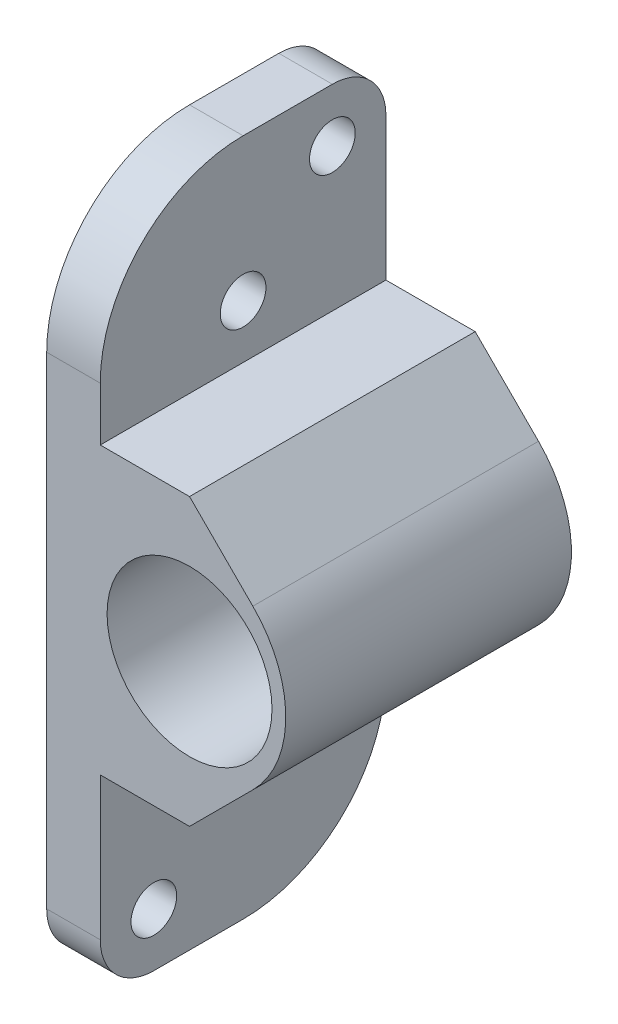
ISO-10303-21;
HEADER;
FILE_DESCRIPTION(('STEP AP214'),'2;1');
FILE_NAME('part.step','',(''),(''),'','','');
FILE_SCHEMA(('AUTOMOTIVE_DESIGN { 1 0 10303 214 1 1 1 1 }'));
ENDSEC;
DATA;
#1=APPLICATION_CONTEXT('core data for automotive mechanical design processes');
#2=APPLICATION_PROTOCOL_DEFINITION('international standard','automotive_design',2000,#1);
#3=PRODUCT_CONTEXT('',#1,'mechanical');
#4=PRODUCT('Part','Part','',(#3));
#5=PRODUCT_RELATED_PRODUCT_CATEGORY('part','',(#4));
#6=PRODUCT_DEFINITION_FORMATION('','',#4);
#7=PRODUCT_DEFINITION_CONTEXT('part definition',#1,'design');
#8=PRODUCT_DEFINITION('design','',#6,#7);
#9=PRODUCT_DEFINITION_SHAPE('','',#8);
#10=(LENGTH_UNIT() NAMED_UNIT(*) SI_UNIT(.MILLI.,.METRE.));
#11=(NAMED_UNIT(*) PLANE_ANGLE_UNIT() SI_UNIT($,.RADIAN.));
#12=(NAMED_UNIT(*) SI_UNIT($,.STERADIAN.) SOLID_ANGLE_UNIT());
#13=UNCERTAINTY_MEASURE_WITH_UNIT(LENGTH_MEASURE(1.E-05),#10,'distance_accuracy_value','');
#14=(GEOMETRIC_REPRESENTATION_CONTEXT(3) GLOBAL_UNCERTAINTY_ASSIGNED_CONTEXT((#13)) GLOBAL_UNIT_ASSIGNED_CONTEXT((#10,
#11,#12)) REPRESENTATION_CONTEXT('',''));
#15=CARTESIAN_POINT('',(0.,0.,0.));
#16=DIRECTION('',(0.,0.,1.));
#17=DIRECTION('',(1.,0.,0.));
#18=AXIS2_PLACEMENT_3D('',#15,#16,#17);
#19=CARTESIAN_POINT('',(-12.7,12.7,25.4));
#20=DIRECTION('',(0.,-1.,0.));
#21=DIRECTION('',(1.,0.,0.));
#22=AXIS2_PLACEMENT_3D('',#19,#20,#21);
#23=PLANE('',#22);
#24=DIRECTION('',(0.,0.,-1.));
#25=VECTOR('',#24,1.);
#26=CARTESIAN_POINT('',(-7.93749999999999,12.7,0.));
#27=LINE('',#26,#25);
#28=CARTESIAN_POINT('',(-7.93749999999999,12.7,25.4));
#29=VERTEX_POINT('',#28);
#30=CARTESIAN_POINT('',(-7.93749999999999,12.7,0.));
#31=VERTEX_POINT('',#30);
#32=EDGE_CURVE('E59',#29,#31,#27,.T.);
#33=ORIENTED_EDGE('',*,*,#32,.F.);
#34=DIRECTION('',(-1.,0.,0.));
#35=VECTOR('',#34,1.);
#36=CARTESIAN_POINT('',(-12.7,12.7,25.4));
#37=LINE('',#36,#35);
#38=CARTESIAN_POINT('',(0.,12.7,25.4));
#39=VERTEX_POINT('',#38);
#40=EDGE_CURVE('E168',#39,#29,#37,.T.);
#41=ORIENTED_EDGE('',*,*,#40,.F.);
#42=DIRECTION('',(0.,0.,-1.));
#43=VECTOR('',#42,1.);
#44=CARTESIAN_POINT('',(0.,12.7,25.4));
#45=LINE('',#44,#43);
#46=CARTESIAN_POINT('',(0.,12.7,0.));
#47=VERTEX_POINT('',#46);
#48=EDGE_CURVE('E280',#39,#47,#45,.T.);
#49=ORIENTED_EDGE('',*,*,#48,.T.);
#50=DIRECTION('',(-1.,0.,0.));
#51=VECTOR('',#50,1.);
#52=CARTESIAN_POINT('',(-12.7,12.7,0.));
#53=LINE('',#52,#51);
#54=EDGE_CURVE('E252',#47,#31,#53,.T.);
#55=ORIENTED_EDGE('',*,*,#54,.T.);
#56=EDGE_LOOP('',(#33,#41,#49,#55));
#57=FACE_BOUND('',#56,.T.);
#58=ADVANCED_FACE('F43',(#57),#23,.F.);
#59=CARTESIAN_POINT('',(-12.7,-12.7,25.4));
#60=DIRECTION('',(0.,1.,0.));
#61=DIRECTION('',(0.,0.,1.));
#62=AXIS2_PLACEMENT_3D('',#59,#60,#61);
#63=PLANE('',#62);
#64=DIRECTION('',(0.,0.,1.));
#65=VECTOR('',#64,1.);
#66=CARTESIAN_POINT('',(-7.9375,-12.7,0.));
#67=LINE('',#66,#65);
#68=CARTESIAN_POINT('',(-7.9375,-12.7,0.));
#69=VERTEX_POINT('',#68);
#70=CARTESIAN_POINT('',(-7.9375,-12.7,25.4));
#71=VERTEX_POINT('',#70);
#72=EDGE_CURVE('E69',#69,#71,#67,.T.);
#73=ORIENTED_EDGE('',*,*,#72,.F.);
#74=DIRECTION('',(1.,0.,0.));
#75=VECTOR('',#74,1.);
#76=CARTESIAN_POINT('',(-12.7,-12.7,0.));
#77=LINE('',#76,#75);
#78=CARTESIAN_POINT('',(0.,-12.7,0.));
#79=VERTEX_POINT('',#78);
#80=EDGE_CURVE('E257',#69,#79,#77,.T.);
#81=ORIENTED_EDGE('',*,*,#80,.T.);
#82=DIRECTION('',(0.,0.,1.));
#83=VECTOR('',#82,1.);
#84=CARTESIAN_POINT('',(0.,-12.7,25.4));
#85=LINE('',#84,#83);
#86=CARTESIAN_POINT('',(0.,-12.7,25.4));
#87=VERTEX_POINT('',#86);
#88=EDGE_CURVE('E268',#79,#87,#85,.T.);
#89=ORIENTED_EDGE('',*,*,#88,.T.);
#90=DIRECTION('',(1.,0.,0.));
#91=VECTOR('',#90,1.);
#92=CARTESIAN_POINT('',(-12.7,-12.7,25.4));
#93=LINE('',#92,#91);
#94=EDGE_CURVE('E259',#71,#87,#93,.T.);
#95=ORIENTED_EDGE('',*,*,#94,.F.);
#96=EDGE_LOOP('',(#73,#81,#89,#95));
#97=FACE_BOUND('',#96,.T.);
#98=ADVANCED_FACE('F302',(#97),#63,.F.);
#99=CARTESIAN_POINT('',(0.,0.,25.4));
#100=DIRECTION('',(0.,0.,-1.));
#101=DIRECTION('',(-1.,0.,0.));
#102=AXIS2_PLACEMENT_3D('',#99,#100,#101);
#103=PLANE('',#102);
#104=DIRECTION('',(-0.707106781186549,-0.707106781186546,0.));
#105=VECTOR('',#104,1.);
#106=CARTESIAN_POINT('',(12.7,0.,25.4));
#107=LINE('',#106,#105);
#108=CARTESIAN_POINT('',(5.62893218813449,-7.07106781186549,25.4));
#109=VERTEX_POINT('',#108);
#110=EDGE_CURVE('E273',#87,#109,#107,.F.);
#111=ORIENTED_EDGE('',*,*,#110,.T.);
#112=CARTESIAN_POINT('',(-1.44213562373097,0.,25.4));
#113=DIRECTION('',(0.,0.,-1.));
#114=DIRECTION('',(-1.,0.,0.));
#115=AXIS2_PLACEMENT_3D('',#112,#113,#114);
#116=CIRCLE('',#115,10.);
#117=CARTESIAN_POINT('',(5.62893218813452,7.07106781186546,25.4));
#118=VERTEX_POINT('',#117);
#119=EDGE_CURVE('E281',#109,#118,#116,.F.);
#120=ORIENTED_EDGE('',*,*,#119,.T.);
#121=DIRECTION('',(0.707106781186546,-0.707106781186549,0.));
#122=VECTOR('',#121,1.);
#123=CARTESIAN_POINT('',(0.,12.7,25.4));
#124=LINE('',#123,#122);
#125=EDGE_CURVE('E271',#118,#39,#124,.F.);
#126=ORIENTED_EDGE('',*,*,#125,.T.);
#127=ORIENTED_EDGE('',*,*,#40,.T.);
#128=DIRECTION('',(0.,1.,0.));
#129=VECTOR('',#128,1.);
#130=CARTESIAN_POINT('',(-7.93749999999999,0.,25.4));
#131=LINE('',#130,#129);
#132=CARTESIAN_POINT('',(-7.93749999999999,17.4625,25.4));
#133=VERTEX_POINT('',#132);
#134=EDGE_CURVE('E160',#29,#133,#131,.T.);
#135=ORIENTED_EDGE('',*,*,#134,.T.);
#136=DIRECTION('',(-1.,0.,0.));
#137=VECTOR('',#136,1.);
#138=CARTESIAN_POINT('',(-7.93749999999999,17.4625,25.4));
#139=LINE('',#138,#137);
#140=CARTESIAN_POINT('',(-12.7,17.4625,25.4));
#141=VERTEX_POINT('',#140);
#142=EDGE_CURVE('E143',#133,#141,#139,.T.);
#143=ORIENTED_EDGE('',*,*,#142,.T.);
#144=DIRECTION('',(0.,-1.,0.));
#145=VECTOR('',#144,1.);
#146=CARTESIAN_POINT('',(-12.7,-12.7,25.4));
#147=LINE('',#146,#145);
#148=CARTESIAN_POINT('',(-12.7,-25.4,25.4));
#149=VERTEX_POINT('',#148);
#150=EDGE_CURVE('E253',#141,#149,#147,.T.);
#151=ORIENTED_EDGE('',*,*,#150,.T.);
#152=DIRECTION('',(-1.,0.,0.));
#153=VECTOR('',#152,1.);
#154=CARTESIAN_POINT('',(-7.9375,-25.4,25.4));
#155=LINE('',#154,#153);
#156=CARTESIAN_POINT('',(-7.9375,-25.4,25.4));
#157=VERTEX_POINT('',#156);
#158=EDGE_CURVE('E221',#157,#149,#155,.T.);
#159=ORIENTED_EDGE('',*,*,#158,.F.);
#160=DIRECTION('',(0.,-1.,0.));
#161=VECTOR('',#160,1.);
#162=CARTESIAN_POINT('',(-7.93749999999999,0.,25.4));
#163=LINE('',#162,#161);
#164=EDGE_CURVE('E214',#71,#157,#163,.T.);
#165=ORIENTED_EDGE('',*,*,#164,.F.);
#166=ORIENTED_EDGE('',*,*,#94,.T.);
#167=EDGE_LOOP('',(#111,#120,#126,#127,#135,#143,#151,#159,#165,#166));
#168=FACE_BOUND('',#167,.T.);
#169=CARTESIAN_POINT('',(0.,0.,25.4));
#170=DIRECTION('',(0.,0.,1.));
#171=DIRECTION('',(1.,0.,0.));
#172=AXIS2_PLACEMENT_3D('',#169,#170,#171);
#173=CIRCLE('',#172,7.33234841870824);
#174=CARTESIAN_POINT('',(7.33234841870824,0.,25.4));
#175=VERTEX_POINT('',#174);
#176=EDGE_CURVE('E247',#175,#175,#173,.T.);
#177=ORIENTED_EDGE('',*,*,#176,.F.);
#178=EDGE_LOOP('',(#177));
#179=FACE_BOUND('',#178,.T.);
#180=ADVANCED_FACE('F165',(#168,#179),#103,.F.);
#181=CARTESIAN_POINT('',(0.,0.,0.));
#182=DIRECTION('',(0.,0.,-1.));
#183=DIRECTION('',(-1.,0.,0.));
#184=AXIS2_PLACEMENT_3D('',#181,#182,#183);
#185=PLANE('',#184);
#186=DIRECTION('',(-0.707106781186546,0.707106781186549,0.));
#187=VECTOR('',#186,1.);
#188=CARTESIAN_POINT('',(6.35,6.34999999999998,0.));
#189=LINE('',#188,#187);
#190=CARTESIAN_POINT('',(5.62893218813452,7.07106781186546,0.));
#191=VERTEX_POINT('',#190);
#192=EDGE_CURVE('E258',#47,#191,#189,.F.);
#193=ORIENTED_EDGE('',*,*,#192,.T.);
#194=CARTESIAN_POINT('',(-1.44213562373097,0.,0.));
#195=DIRECTION('',(0.,0.,-1.));
#196=DIRECTION('',(-1.,0.,0.));
#197=AXIS2_PLACEMENT_3D('',#194,#195,#196);
#198=CIRCLE('',#197,10.);
#199=CARTESIAN_POINT('',(5.6289321881345,-7.07106781186549,0.));
#200=VERTEX_POINT('',#199);
#201=EDGE_CURVE('E11',#191,#200,#198,.T.);
#202=ORIENTED_EDGE('',*,*,#201,.T.);
#203=DIRECTION('',(0.707106781186549,0.707106781186546,0.));
#204=VECTOR('',#203,1.);
#205=CARTESIAN_POINT('',(6.34999999999998,-6.35,0.));
#206=LINE('',#205,#204);
#207=EDGE_CURVE('E269',#200,#79,#206,.F.);
#208=ORIENTED_EDGE('',*,*,#207,.T.);
#209=ORIENTED_EDGE('',*,*,#80,.F.);
#210=DIRECTION('',(0.,-1.,0.));
#211=VECTOR('',#210,1.);
#212=CARTESIAN_POINT('',(-7.93749999999999,0.,0.));
#213=LINE('',#212,#211);
#214=CARTESIAN_POINT('',(-7.9375,-17.4625,0.));
#215=VERTEX_POINT('',#214);
#216=EDGE_CURVE('E219',#69,#215,#213,.T.);
#217=ORIENTED_EDGE('',*,*,#216,.T.);
#218=DIRECTION('',(-1.,0.,0.));
#219=VECTOR('',#218,1.);
#220=CARTESIAN_POINT('',(-7.9375,-17.4625,0.));
#221=LINE('',#220,#219);
#222=CARTESIAN_POINT('',(-12.7,-17.4625,0.));
#223=VERTEX_POINT('',#222);
#224=EDGE_CURVE('E243',#215,#223,#221,.T.);
#225=ORIENTED_EDGE('',*,*,#224,.T.);
#226=DIRECTION('',(0.,-1.,0.));
#227=VECTOR('',#226,1.);
#228=CARTESIAN_POINT('',(-12.7,-12.7,0.));
#229=LINE('',#228,#227);
#230=CARTESIAN_POINT('',(-12.7,25.4,0.));
#231=VERTEX_POINT('',#230);
#232=EDGE_CURVE('E261',#231,#223,#229,.T.);
#233=ORIENTED_EDGE('',*,*,#232,.F.);
#234=DIRECTION('',(-1.,0.,0.));
#235=VECTOR('',#234,1.);
#236=CARTESIAN_POINT('',(-7.93749999999998,25.4,0.));
#237=LINE('',#236,#235);
#238=CARTESIAN_POINT('',(-7.93749999999998,25.4,0.));
#239=VERTEX_POINT('',#238);
#240=EDGE_CURVE('E193',#239,#231,#237,.T.);
#241=ORIENTED_EDGE('',*,*,#240,.F.);
#242=DIRECTION('',(0.,1.,0.));
#243=VECTOR('',#242,1.);
#244=CARTESIAN_POINT('',(-7.93749999999999,0.,0.));
#245=LINE('',#244,#243);
#246=EDGE_CURVE('E180',#31,#239,#245,.T.);
#247=ORIENTED_EDGE('',*,*,#246,.F.);
#248=ORIENTED_EDGE('',*,*,#54,.F.);
#249=EDGE_LOOP('',(#193,#202,#208,#209,#217,#225,#233,#241,#247,#248));
#250=FACE_BOUND('',#249,.T.);
#251=CARTESIAN_POINT('',(0.,0.,0.));
#252=DIRECTION('',(0.,0.,1.));
#253=DIRECTION('',(1.,0.,0.));
#254=AXIS2_PLACEMENT_3D('',#251,#252,#253);
#255=CIRCLE('',#254,7.33234841870824);
#256=CARTESIAN_POINT('',(7.33234841870824,0.,0.));
#257=VERTEX_POINT('',#256);
#258=EDGE_CURVE('E200',#257,#257,#255,.T.);
#259=ORIENTED_EDGE('',*,*,#258,.T.);
#260=EDGE_LOOP('',(#259));
#261=FACE_BOUND('',#260,.T.);
#262=ADVANCED_FACE('F291',(#250,#261),#185,.T.);
#263=CARTESIAN_POINT('',(-12.7,-12.7,25.4));
#264=DIRECTION('',(1.,0.,0.));
#265=DIRECTION('',(0.,1.,0.));
#266=AXIS2_PLACEMENT_3D('',#263,#264,#265);
#267=PLANE('',#266);
#268=ORIENTED_EDGE('',*,*,#232,.T.);
#269=CARTESIAN_POINT('',(-12.7,-17.4625,12.7));
#270=DIRECTION('',(-1.,0.,0.));
#271=DIRECTION('',(0.,-1.,0.));
#272=AXIS2_PLACEMENT_3D('',#269,#270,#271);
#273=CIRCLE('',#272,12.7);
#274=CARTESIAN_POINT('',(-12.7,-30.1625,12.7));
#275=VERTEX_POINT('',#274);
#276=EDGE_CURVE('E234',#223,#275,#273,.T.);
#277=ORIENTED_EDGE('',*,*,#276,.T.);
#278=DIRECTION('',(0.,0.,-1.));
#279=VECTOR('',#278,1.);
#280=CARTESIAN_POINT('',(-12.7,-30.1625,0.));
#281=LINE('',#280,#279);
#282=CARTESIAN_POINT('',(-12.7,-30.1625,20.6375));
#283=VERTEX_POINT('',#282);
#284=EDGE_CURVE('E210',#283,#275,#281,.T.);
#285=ORIENTED_EDGE('',*,*,#284,.F.);
#286=CARTESIAN_POINT('',(-12.7,-25.4,20.6375));
#287=DIRECTION('',(-1.,0.,0.));
#288=DIRECTION('',(0.,-1.,0.));
#289=AXIS2_PLACEMENT_3D('',#286,#287,#288);
#290=CIRCLE('',#289,4.7625);
#291=EDGE_CURVE('E233',#149,#283,#290,.F.);
#292=ORIENTED_EDGE('',*,*,#291,.F.);
#293=ORIENTED_EDGE('',*,*,#150,.F.);
#294=CARTESIAN_POINT('',(-12.7,17.4625,12.7));
#295=DIRECTION('',(-1.,0.,0.));
#296=DIRECTION('',(0.,-1.,0.));
#297=AXIS2_PLACEMENT_3D('',#294,#295,#296);
#298=CIRCLE('',#297,12.7);
#299=CARTESIAN_POINT('',(-12.7,30.1625,12.7));
#300=VERTEX_POINT('',#299);
#301=EDGE_CURVE('E148',#141,#300,#298,.T.);
#302=ORIENTED_EDGE('',*,*,#301,.T.);
#303=DIRECTION('',(0.,0.,1.));
#304=VECTOR('',#303,1.);
#305=CARTESIAN_POINT('',(-12.7,30.1625,0.));
#306=LINE('',#305,#304);
#307=CARTESIAN_POINT('',(-12.7,30.1625,4.7625));
#308=VERTEX_POINT('',#307);
#309=EDGE_CURVE('E186',#308,#300,#306,.T.);
#310=ORIENTED_EDGE('',*,*,#309,.F.);
#311=CARTESIAN_POINT('',(-12.7,25.4,4.7625));
#312=DIRECTION('',(-1.,0.,0.));
#313=DIRECTION('',(0.,-1.,0.));
#314=AXIS2_PLACEMENT_3D('',#311,#312,#313);
#315=CIRCLE('',#314,4.7625);
#316=EDGE_CURVE('E195',#231,#308,#315,.F.);
#317=ORIENTED_EDGE('',*,*,#316,.F.);
#318=EDGE_LOOP('',(#268,#277,#285,#292,#293,#302,#310,#317));
#319=FACE_BOUND('',#318,.T.);
#320=CARTESIAN_POINT('',(-12.7,-25.4,20.6375));
#321=DIRECTION('',(-1.,0.,0.));
#322=DIRECTION('',(0.,-1.,0.));
#323=AXIS2_PLACEMENT_3D('',#320,#321,#322);
#324=CIRCLE('',#323,2.032);
#325=CARTESIAN_POINT('',(-12.7,-27.432,20.6375));
#326=VERTEX_POINT('',#325);
#327=EDGE_CURVE('E223',#326,#326,#324,.T.);
#328=ORIENTED_EDGE('',*,*,#327,.F.);
#329=EDGE_LOOP('',(#328));
#330=FACE_BOUND('',#329,.T.);
#331=CARTESIAN_POINT('',(-12.7,-17.4625,12.7));
#332=DIRECTION('',(-1.,0.,0.));
#333=DIRECTION('',(0.,-1.,0.));
#334=AXIS2_PLACEMENT_3D('',#331,#332,#333);
#335=CIRCLE('',#334,2.032);
#336=CARTESIAN_POINT('',(-12.7,-19.4945,12.7));
#337=VERTEX_POINT('',#336);
#338=EDGE_CURVE('E226',#337,#337,#335,.T.);
#339=ORIENTED_EDGE('',*,*,#338,.F.);
#340=EDGE_LOOP('',(#339));
#341=FACE_BOUND('',#340,.T.);
#342=CARTESIAN_POINT('',(-12.7,17.4625,12.7));
#343=DIRECTION('',(-1.,0.,0.));
#344=DIRECTION('',(0.,-1.,0.));
#345=AXIS2_PLACEMENT_3D('',#342,#343,#344);
#346=CIRCLE('',#345,2.032);
#347=CARTESIAN_POINT('',(-12.7,15.4305,12.7));
#348=VERTEX_POINT('',#347);
#349=EDGE_CURVE('E181',#348,#348,#346,.T.);
#350=ORIENTED_EDGE('',*,*,#349,.F.);
#351=EDGE_LOOP('',(#350));
#352=FACE_BOUND('',#351,.T.);
#353=CARTESIAN_POINT('',(-12.7,25.4,4.7625));
#354=DIRECTION('',(-1.,0.,0.));
#355=DIRECTION('',(0.,-1.,0.));
#356=AXIS2_PLACEMENT_3D('',#353,#354,#355);
#357=CIRCLE('',#356,2.032);
#358=CARTESIAN_POINT('',(-12.7,23.368,4.7625));
#359=VERTEX_POINT('',#358);
#360=EDGE_CURVE('E183',#359,#359,#357,.T.);
#361=ORIENTED_EDGE('',*,*,#360,.F.);
#362=EDGE_LOOP('',(#361));
#363=FACE_BOUND('',#362,.T.);
#364=ADVANCED_FACE('F317',(#319,#330,#341,#352,#363),#267,.F.);
#365=CARTESIAN_POINT('',(0.,0.,25.4));
#366=DIRECTION('',(0.,0.,-1.));
#367=DIRECTION('',(-1.,0.,0.));
#368=AXIS2_PLACEMENT_3D('',#365,#366,#367);
#369=CYLINDRICAL_SURFACE('',#368,7.33234841870824);
#370=ORIENTED_EDGE('',*,*,#176,.T.);
#371=EDGE_LOOP('',(#370));
#372=FACE_BOUND('',#371,.T.);
#373=ORIENTED_EDGE('',*,*,#258,.F.);
#374=EDGE_LOOP('',(#373));
#375=FACE_BOUND('',#374,.T.);
#376=ADVANCED_FACE('F357',(#372,#375),#369,.F.);
#377=CARTESIAN_POINT('',(0.,12.7,25.4));
#378=DIRECTION('',(-0.707106781186549,-0.707106781186546,0.));
#379=DIRECTION('',(0.,0.,-1.));
#380=AXIS2_PLACEMENT_3D('',#377,#378,#379);
#381=PLANE('',#380);
#382=ORIENTED_EDGE('',*,*,#125,.F.);
#383=DIRECTION('',(0.,0.,-1.));
#384=VECTOR('',#383,1.);
#385=CARTESIAN_POINT('',(5.62893218813452,7.07106781186546,25.4));
#386=LINE('',#385,#384);
#387=EDGE_CURVE('E51',#118,#191,#386,.T.);
#388=ORIENTED_EDGE('',*,*,#387,.T.);
#389=ORIENTED_EDGE('',*,*,#192,.F.);
#390=ORIENTED_EDGE('',*,*,#48,.F.);
#391=EDGE_LOOP('',(#382,#388,#389,#390));
#392=FACE_BOUND('',#391,.T.);
#393=ADVANCED_FACE('F289',(#392),#381,.F.);
#394=CARTESIAN_POINT('',(12.7,0.,25.4));
#395=DIRECTION('',(-0.707106781186546,0.707106781186549,0.));
#396=DIRECTION('',(0.,0.,-1.));
#397=AXIS2_PLACEMENT_3D('',#394,#395,#396);
#398=PLANE('',#397);
#399=ORIENTED_EDGE('',*,*,#207,.F.);
#400=DIRECTION('',(0.,0.,-1.));
#401=VECTOR('',#400,1.);
#402=CARTESIAN_POINT('',(5.6289321881345,-7.07106781186548,25.4));
#403=LINE('',#402,#401);
#404=EDGE_CURVE('E276',#200,#109,#403,.F.);
#405=ORIENTED_EDGE('',*,*,#404,.T.);
#406=ORIENTED_EDGE('',*,*,#110,.F.);
#407=ORIENTED_EDGE('',*,*,#88,.F.);
#408=EDGE_LOOP('',(#399,#405,#406,#407));
#409=FACE_BOUND('',#408,.T.);
#410=ADVANCED_FACE('F297',(#409),#398,.F.);
#411=CARTESIAN_POINT('',(-1.44213562373097,0.,25.4));
#412=DIRECTION('',(0.,0.,1.));
#413=DIRECTION('',(1.,0.,0.));
#414=AXIS2_PLACEMENT_3D('',#411,#412,#413);
#415=CYLINDRICAL_SURFACE('',#414,10.);
#416=ORIENTED_EDGE('',*,*,#201,.F.);
#417=ORIENTED_EDGE('',*,*,#387,.F.);
#418=ORIENTED_EDGE('',*,*,#119,.F.);
#419=ORIENTED_EDGE('',*,*,#404,.F.);
#420=EDGE_LOOP('',(#416,#417,#418,#419));
#421=FACE_BOUND('',#420,.T.);
#422=ADVANCED_FACE('F44',(#421),#415,.T.);
#423=CARTESIAN_POINT('',(-7.9375,-25.4,20.6375));
#424=DIRECTION('',(-1.,0.,0.));
#425=DIRECTION('',(0.,-1.,0.));
#426=AXIS2_PLACEMENT_3D('',#423,#424,#425);
#427=CYLINDRICAL_SURFACE('',#426,4.7625);
#428=ORIENTED_EDGE('',*,*,#291,.T.);
#429=DIRECTION('',(-1.,0.,0.));
#430=VECTOR('',#429,1.);
#431=CARTESIAN_POINT('',(-7.93750000000001,-30.1625,20.6375));
#432=LINE('',#431,#430);
#433=CARTESIAN_POINT('',(-7.93750000000001,-30.1625,20.6375));
#434=VERTEX_POINT('',#433);
#435=EDGE_CURVE('E184',#434,#283,#432,.T.);
#436=ORIENTED_EDGE('',*,*,#435,.F.);
#437=CARTESIAN_POINT('',(-7.9375,-25.4,20.6375));
#438=DIRECTION('',(-1.,0.,0.));
#439=DIRECTION('',(0.,-1.,0.));
#440=AXIS2_PLACEMENT_3D('',#437,#438,#439);
#441=CIRCLE('',#440,4.7625);
#442=EDGE_CURVE('E208',#157,#434,#441,.F.);
#443=ORIENTED_EDGE('',*,*,#442,.F.);
#444=ORIENTED_EDGE('',*,*,#158,.T.);
#445=EDGE_LOOP('',(#428,#436,#443,#444));
#446=FACE_BOUND('',#445,.T.);
#447=ADVANCED_FACE('F329',(#446),#427,.T.);
#448=CARTESIAN_POINT('',(-7.93750000000001,-30.1625,0.));
#449=DIRECTION('',(0.,1.,0.));
#450=DIRECTION('',(-1.,0.,0.));
#451=AXIS2_PLACEMENT_3D('',#448,#449,#450);
#452=PLANE('',#451);
#453=ORIENTED_EDGE('',*,*,#284,.T.);
#454=DIRECTION('',(-1.,0.,0.));
#455=VECTOR('',#454,1.);
#456=CARTESIAN_POINT('',(-7.93750000000001,-30.1625,12.7));
#457=LINE('',#456,#455);
#458=CARTESIAN_POINT('',(-7.93750000000001,-30.1625,12.7));
#459=VERTEX_POINT('',#458);
#460=EDGE_CURVE('E241',#459,#275,#457,.T.);
#461=ORIENTED_EDGE('',*,*,#460,.F.);
#462=DIRECTION('',(0.,0.,-1.));
#463=VECTOR('',#462,1.);
#464=CARTESIAN_POINT('',(-7.93750000000001,-30.1625,0.));
#465=LINE('',#464,#463);
#466=EDGE_CURVE('E224',#434,#459,#465,.T.);
#467=ORIENTED_EDGE('',*,*,#466,.F.);
#468=ORIENTED_EDGE('',*,*,#435,.T.);
#469=EDGE_LOOP('',(#453,#461,#467,#468));
#470=FACE_BOUND('',#469,.T.);
#471=ADVANCED_FACE('F328',(#470),#452,.F.);
#472=CARTESIAN_POINT('',(-7.9375,-17.4625,12.7));
#473=DIRECTION('',(-1.,0.,0.));
#474=DIRECTION('',(0.,-1.,0.));
#475=AXIS2_PLACEMENT_3D('',#472,#473,#474);
#476=CYLINDRICAL_SURFACE('',#475,12.7);
#477=ORIENTED_EDGE('',*,*,#276,.F.);
#478=ORIENTED_EDGE('',*,*,#224,.F.);
#479=CARTESIAN_POINT('',(-7.9375,-17.4625,12.7));
#480=DIRECTION('',(-1.,0.,0.));
#481=DIRECTION('',(0.,-1.,0.));
#482=AXIS2_PLACEMENT_3D('',#479,#480,#481);
#483=CIRCLE('',#482,12.7);
#484=EDGE_CURVE('E218',#215,#459,#483,.T.);
#485=ORIENTED_EDGE('',*,*,#484,.T.);
#486=ORIENTED_EDGE('',*,*,#460,.T.);
#487=EDGE_LOOP('',(#477,#478,#485,#486));
#488=FACE_BOUND('',#487,.T.);
#489=ADVANCED_FACE('F312',(#488),#476,.T.);
#490=CARTESIAN_POINT('',(-7.9375,-17.4625,12.7));
#491=DIRECTION('',(-1.,0.,0.));
#492=DIRECTION('',(0.,-1.,0.));
#493=AXIS2_PLACEMENT_3D('',#490,#491,#492);
#494=CYLINDRICAL_SURFACE('',#493,2.032);
#495=CARTESIAN_POINT('',(-7.9375,-17.4625,12.7));
#496=DIRECTION('',(-1.,0.,0.));
#497=DIRECTION('',(0.,-1.,0.));
#498=AXIS2_PLACEMENT_3D('',#495,#496,#497);
#499=CIRCLE('',#498,2.032);
#500=CARTESIAN_POINT('',(-7.9375,-19.4945,12.7));
#501=VERTEX_POINT('',#500);
#502=EDGE_CURVE('E207',#501,#501,#499,.T.);
#503=CARTESIAN_POINT('',(-7.9375,-19.4945,12.7));
#504=CARTESIAN_POINT('',(-7.987109375,-19.4945,12.7));
#505=CARTESIAN_POINT('',(-8.03671875,-19.4945,12.7));
#506=CARTESIAN_POINT('',(-8.1359375,-19.4945,12.7));
#507=CARTESIAN_POINT('',(-8.185546875,-19.4945,12.7));
#508=CARTESIAN_POINT('',(-8.284765625,-19.4945,12.7));
#509=CARTESIAN_POINT('',(-8.334375,-19.4945,12.7));
#510=CARTESIAN_POINT('',(-8.43359375,-19.4945,12.7));
#511=CARTESIAN_POINT('',(-8.483203125,-19.4945,12.7));
#512=CARTESIAN_POINT('',(-8.582421875,-19.4945,12.7));
#513=CARTESIAN_POINT('',(-8.63203125,-19.4945,12.7));
#514=CARTESIAN_POINT('',(-8.73125,-19.4945,12.7));
#515=CARTESIAN_POINT('',(-8.780859375,-19.4945,12.7));
#516=CARTESIAN_POINT('',(-8.880078125,-19.4945,12.7));
#517=CARTESIAN_POINT('',(-8.9296875,-19.4945,12.7));
#518=CARTESIAN_POINT('',(-9.02890625,-19.4945,12.7));
#519=CARTESIAN_POINT('',(-9.078515625,-19.4945,12.7));
#520=CARTESIAN_POINT('',(-9.177734375,-19.4945,12.7));
#521=CARTESIAN_POINT('',(-9.22734375,-19.4945,12.7));
#522=CARTESIAN_POINT('',(-9.3265625,-19.4945,12.7));
#523=CARTESIAN_POINT('',(-9.376171875,-19.4945,12.7));
#524=CARTESIAN_POINT('',(-9.475390625,-19.4945,12.7));
#525=CARTESIAN_POINT('',(-9.525,-19.4945,12.7));
#526=CARTESIAN_POINT('',(-9.62421875,-19.4945,12.7));
#527=CARTESIAN_POINT('',(-9.673828125,-19.4945,12.7));
#528=CARTESIAN_POINT('',(-9.773046875,-19.4945,12.7));
#529=CARTESIAN_POINT('',(-9.82265625,-19.4945,12.7));
#530=CARTESIAN_POINT('',(-9.921875,-19.4945,12.7));
#531=CARTESIAN_POINT('',(-9.971484375,-19.4945,12.7));
#532=CARTESIAN_POINT('',(-10.070703125,-19.4945,12.7));
#533=CARTESIAN_POINT('',(-10.1203125,-19.4945,12.7));
#534=CARTESIAN_POINT('',(-10.21953125,-19.4945,12.7));
#535=CARTESIAN_POINT('',(-10.269140625,-19.4945,12.7));
#536=CARTESIAN_POINT('',(-10.368359375,-19.4945,12.7));
#537=CARTESIAN_POINT('',(-10.41796875,-19.4945,12.7));
#538=CARTESIAN_POINT('',(-10.5171875,-19.4945,12.7));
#539=CARTESIAN_POINT('',(-10.566796875,-19.4945,12.7));
#540=CARTESIAN_POINT('',(-10.666015625,-19.4945,12.7));
#541=CARTESIAN_POINT('',(-10.715625,-19.4945,12.7));
#542=CARTESIAN_POINT('',(-10.81484375,-19.4945,12.7));
#543=CARTESIAN_POINT('',(-10.864453125,-19.4945,12.7));
#544=CARTESIAN_POINT('',(-10.963671875,-19.4945,12.7));
#545=CARTESIAN_POINT('',(-11.01328125,-19.4945,12.7));
#546=CARTESIAN_POINT('',(-11.1125,-19.4945,12.7));
#547=CARTESIAN_POINT('',(-11.162109375,-19.4945,12.7));
#548=CARTESIAN_POINT('',(-11.261328125,-19.4945,12.7));
#549=CARTESIAN_POINT('',(-11.3109375,-19.4945,12.7));
#550=CARTESIAN_POINT('',(-11.41015625,-19.4945,12.7));
#551=CARTESIAN_POINT('',(-11.459765625,-19.4945,12.7));
#552=CARTESIAN_POINT('',(-11.558984375,-19.4945,12.7));
#553=CARTESIAN_POINT('',(-11.60859375,-19.4945,12.7));
#554=CARTESIAN_POINT('',(-11.7078125,-19.4945,12.7));
#555=CARTESIAN_POINT('',(-11.757421875,-19.4945,12.7));
#556=CARTESIAN_POINT('',(-11.856640625,-19.4945,12.7));
#557=CARTESIAN_POINT('',(-11.90625,-19.4945,12.7));
#558=CARTESIAN_POINT('',(-12.00546875,-19.4945,12.7));
#559=CARTESIAN_POINT('',(-12.055078125,-19.4945,12.7));
#560=CARTESIAN_POINT('',(-12.154296875,-19.4945,12.7));
#561=CARTESIAN_POINT('',(-12.20390625,-19.4945,12.7));
#562=CARTESIAN_POINT('',(-12.303125,-19.4945,12.7));
#563=CARTESIAN_POINT('',(-12.352734375,-19.4945,12.7));
#564=CARTESIAN_POINT('',(-12.451953125,-19.4945,12.7));
#565=CARTESIAN_POINT('',(-12.5015625,-19.4945,12.7));
#566=CARTESIAN_POINT('',(-12.60078125,-19.4945,12.7));
#567=CARTESIAN_POINT('',(-12.650390625,-19.4945,12.7));
#568=CARTESIAN_POINT('',(-12.7,-19.4945,12.7));
#569=B_SPLINE_CURVE_WITH_KNOTS('',3,(#503,#504,#505,#506,#507,#508,#509,#510,#511,#512,#513,
#514,#515,#516,#517,#518,#519,#520,#521,#522,#523,#524,#525,#526,#527,#528,#529,#530,#531,#532,
#533,#534,#535,#536,#537,#538,#539,#540,#541,#542,#543,#544,#545,#546,#547,#548,#549,#550,#551,
#552,#553,#554,#555,#556,#557,#558,#559,#560,#561,#562,#563,#564,#565,#566,#567,#568),
.UNSPECIFIED.,.F.,.F.,(4,2,2,2,2,2,2,2,2,2,2,2,2,2,2,2,2,2,2,2,2,2,2,2,2,2,2,2,2,2,2,2,4),(0.,
0.148828124999998,0.297656249999998,0.446484374999999,0.595312499999999,0.744140624999999,
0.892968749999999,1.041796875,1.190625,1.339453125,1.48828125,1.637109375,1.7859375,1.934765625,
2.08359375,2.232421875,2.38125,2.530078125,2.67890625,2.827734375,2.9765625,3.125390625,
3.27421875,3.423046875,3.571875,3.720703125,3.86953125,4.018359375,4.1671875,4.316015625,
4.46484375,4.613671875,4.7625),.UNSPECIFIED.);
#570=EDGE_CURVE('BSEAM337',#501,#337,#569,.T.);
#571=ORIENTED_EDGE('',*,*,#502,.F.);
#572=ORIENTED_EDGE('',*,*,#338,.T.);
#573=ORIENTED_EDGE('',*,*,#570,.T.);
#574=ORIENTED_EDGE('',*,*,#570,.F.);
#575=EDGE_LOOP('',(#571,#573,#572,#574));
#576=FACE_BOUND('',#575,.T.);
#577=ADVANCED_FACE('F337',(#576),#494,.F.);
#578=CARTESIAN_POINT('',(-7.9375,-25.4,20.6375));
#579=DIRECTION('',(-1.,0.,0.));
#580=DIRECTION('',(0.,-1.,0.));
#581=AXIS2_PLACEMENT_3D('',#578,#579,#580);
#582=CYLINDRICAL_SURFACE('',#581,2.032);
#583=CARTESIAN_POINT('',(-7.9375,-25.4,20.6375));
#584=DIRECTION('',(-1.,0.,0.));
#585=DIRECTION('',(0.,-1.,0.));
#586=AXIS2_PLACEMENT_3D('',#583,#584,#585);
#587=CIRCLE('',#586,2.032);
#588=CARTESIAN_POINT('',(-7.93750000000001,-27.432,20.6375));
#589=VERTEX_POINT('',#588);
#590=EDGE_CURVE('E205',#589,#589,#587,.T.);
#591=CARTESIAN_POINT('',(-7.93750000000001,-27.432,20.6375));
#592=CARTESIAN_POINT('',(-7.987109375,-27.432,20.6375));
#593=CARTESIAN_POINT('',(-8.03671875000001,-27.432,20.6375));
#594=CARTESIAN_POINT('',(-8.1359375,-27.432,20.6375));
#595=CARTESIAN_POINT('',(-8.185546875,-27.432,20.6375));
#596=CARTESIAN_POINT('',(-8.284765625,-27.432,20.6375));
#597=CARTESIAN_POINT('',(-8.334375,-27.432,20.6375));
#598=CARTESIAN_POINT('',(-8.43359375000001,-27.432,20.6375));
#599=CARTESIAN_POINT('',(-8.483203125,-27.432,20.6375));
#600=CARTESIAN_POINT('',(-8.582421875,-27.432,20.6375));
#601=CARTESIAN_POINT('',(-8.63203125,-27.432,20.6375));
#602=CARTESIAN_POINT('',(-8.73125,-27.432,20.6375));
#603=CARTESIAN_POINT('',(-8.780859375,-27.432,20.6375));
#604=CARTESIAN_POINT('',(-8.880078125,-27.432,20.6375));
#605=CARTESIAN_POINT('',(-8.9296875,-27.432,20.6375));
#606=CARTESIAN_POINT('',(-9.02890625000001,-27.432,20.6375));
#607=CARTESIAN_POINT('',(-9.078515625,-27.432,20.6375));
#608=CARTESIAN_POINT('',(-9.17773437500001,-27.432,20.6375));
#609=CARTESIAN_POINT('',(-9.22734375,-27.432,20.6375));
#610=CARTESIAN_POINT('',(-9.3265625,-27.432,20.6375));
#611=CARTESIAN_POINT('',(-9.376171875,-27.432,20.6375));
#612=CARTESIAN_POINT('',(-9.475390625,-27.432,20.6375));
#613=CARTESIAN_POINT('',(-9.525,-27.432,20.6375));
#614=CARTESIAN_POINT('',(-9.62421875000001,-27.432,20.6375));
#615=CARTESIAN_POINT('',(-9.673828125,-27.432,20.6375));
#616=CARTESIAN_POINT('',(-9.77304687500001,-27.432,20.6375));
#617=CARTESIAN_POINT('',(-9.82265625,-27.432,20.6375));
#618=CARTESIAN_POINT('',(-9.92187500000001,-27.432,20.6375));
#619=CARTESIAN_POINT('',(-9.971484375,-27.432,20.6375));
#620=CARTESIAN_POINT('',(-10.070703125,-27.432,20.6375));
#621=CARTESIAN_POINT('',(-10.1203125,-27.432,20.6375));
#622=CARTESIAN_POINT('',(-10.21953125,-27.432,20.6375));
#623=CARTESIAN_POINT('',(-10.269140625,-27.432,20.6375));
#624=CARTESIAN_POINT('',(-10.368359375,-27.432,20.6375));
#625=CARTESIAN_POINT('',(-10.41796875,-27.432,20.6375));
#626=CARTESIAN_POINT('',(-10.5171875,-27.432,20.6375));
#627=CARTESIAN_POINT('',(-10.566796875,-27.432,20.6375));
#628=CARTESIAN_POINT('',(-10.666015625,-27.432,20.6375));
#629=CARTESIAN_POINT('',(-10.715625,-27.432,20.6375));
#630=CARTESIAN_POINT('',(-10.81484375,-27.432,20.6375));
#631=CARTESIAN_POINT('',(-10.864453125,-27.432,20.6375));
#632=CARTESIAN_POINT('',(-10.963671875,-27.432,20.6375));
#633=CARTESIAN_POINT('',(-11.01328125,-27.432,20.6375));
#634=CARTESIAN_POINT('',(-11.1125,-27.432,20.6375));
#635=CARTESIAN_POINT('',(-11.162109375,-27.432,20.6375));
#636=CARTESIAN_POINT('',(-11.261328125,-27.432,20.6375));
#637=CARTESIAN_POINT('',(-11.3109375,-27.432,20.6375));
#638=CARTESIAN_POINT('',(-11.41015625,-27.432,20.6375));
#639=CARTESIAN_POINT('',(-11.459765625,-27.432,20.6375));
#640=CARTESIAN_POINT('',(-11.558984375,-27.432,20.6375));
#641=CARTESIAN_POINT('',(-11.60859375,-27.432,20.6375));
#642=CARTESIAN_POINT('',(-11.7078125,-27.432,20.6375));
#643=CARTESIAN_POINT('',(-11.757421875,-27.432,20.6375));
#644=CARTESIAN_POINT('',(-11.856640625,-27.432,20.6375));
#645=CARTESIAN_POINT('',(-11.90625,-27.432,20.6375));
#646=CARTESIAN_POINT('',(-12.00546875,-27.432,20.6375));
#647=CARTESIAN_POINT('',(-12.055078125,-27.432,20.6375));
#648=CARTESIAN_POINT('',(-12.154296875,-27.432,20.6375));
#649=CARTESIAN_POINT('',(-12.20390625,-27.432,20.6375));
#650=CARTESIAN_POINT('',(-12.303125,-27.432,20.6375));
#651=CARTESIAN_POINT('',(-12.352734375,-27.432,20.6375));
#652=CARTESIAN_POINT('',(-12.451953125,-27.432,20.6375));
#653=CARTESIAN_POINT('',(-12.5015625,-27.432,20.6375));
#654=CARTESIAN_POINT('',(-12.60078125,-27.432,20.6375));
#655=CARTESIAN_POINT('',(-12.650390625,-27.432,20.6375));
#656=CARTESIAN_POINT('',(-12.7,-27.432,20.6375));
#657=B_SPLINE_CURVE_WITH_KNOTS('',3,(#591,#592,#593,#594,#595,#596,#597,#598,#599,#600,#601,
#602,#603,#604,#605,#606,#607,#608,#609,#610,#611,#612,#613,#614,#615,#616,#617,#618,#619,#620,
#621,#622,#623,#624,#625,#626,#627,#628,#629,#630,#631,#632,#633,#634,#635,#636,#637,#638,#639,
#640,#641,#642,#643,#644,#645,#646,#647,#648,#649,#650,#651,#652,#653,#654,#655,#656),
.UNSPECIFIED.,.F.,.F.,(4,2,2,2,2,2,2,2,2,2,2,2,2,2,2,2,2,2,2,2,2,2,2,2,2,2,2,2,2,2,2,2,4),(0.,
0.148828124999998,0.297656249999998,0.446484374999999,0.595312499999999,0.744140624999999,
0.892968749999999,1.041796875,1.190625,1.339453125,1.48828125,1.637109375,1.7859375,1.934765625,
2.08359375,2.232421875,2.38125,2.530078125,2.67890625,2.827734375,2.9765625,3.125390625,
3.27421875,3.423046875,3.571875,3.720703125,3.86953125,4.018359375,4.1671875,4.316015625,
4.46484375,4.613671875,4.7625),.UNSPECIFIED.);
#658=EDGE_CURVE('BSEAM367',#589,#326,#657,.T.);
#659=ORIENTED_EDGE('',*,*,#590,.F.);
#660=ORIENTED_EDGE('',*,*,#327,.T.);
#661=ORIENTED_EDGE('',*,*,#658,.T.);
#662=ORIENTED_EDGE('',*,*,#658,.F.);
#663=EDGE_LOOP('',(#659,#661,#660,#662));
#664=FACE_BOUND('',#663,.T.);
#665=ADVANCED_FACE('F367',(#664),#582,.F.);
#666=CARTESIAN_POINT('',(-7.93749999999999,0.,0.));
#667=DIRECTION('',(-1.,0.,0.));
#668=DIRECTION('',(0.,-1.,0.));
#669=AXIS2_PLACEMENT_3D('',#666,#667,#668);
#670=PLANE('',#669);
#671=ORIENTED_EDGE('',*,*,#590,.T.);
#672=EDGE_LOOP('',(#671));
#673=FACE_BOUND('',#672,.T.);
#674=ORIENTED_EDGE('',*,*,#502,.T.);
#675=EDGE_LOOP('',(#674));
#676=FACE_BOUND('',#675,.T.);
#677=ORIENTED_EDGE('',*,*,#442,.T.);
#678=ORIENTED_EDGE('',*,*,#466,.T.);
#679=ORIENTED_EDGE('',*,*,#484,.F.);
#680=ORIENTED_EDGE('',*,*,#216,.F.);
#681=ORIENTED_EDGE('',*,*,#72,.T.);
#682=ORIENTED_EDGE('',*,*,#164,.T.);
#683=EDGE_LOOP('',(#677,#678,#679,#680,#681,#682));
#684=FACE_BOUND('',#683,.T.);
#685=ADVANCED_FACE('F310',(#673,#676,#684),#670,.F.);
#686=CARTESIAN_POINT('',(-7.93749999999998,25.4,4.7625));
#687=DIRECTION('',(-1.,0.,0.));
#688=DIRECTION('',(0.,-1.,0.));
#689=AXIS2_PLACEMENT_3D('',#686,#687,#688);
#690=CYLINDRICAL_SURFACE('',#689,4.7625);
#691=ORIENTED_EDGE('',*,*,#316,.T.);
#692=DIRECTION('',(-1.,0.,0.));
#693=VECTOR('',#692,1.);
#694=CARTESIAN_POINT('',(-7.93749999999998,30.1625,4.7625));
#695=LINE('',#694,#693);
#696=CARTESIAN_POINT('',(-7.93749999999998,30.1625,4.7625));
#697=VERTEX_POINT('',#696);
#698=EDGE_CURVE('E198',#697,#308,#695,.T.);
#699=ORIENTED_EDGE('',*,*,#698,.F.);
#700=CARTESIAN_POINT('',(-7.93749999999998,25.4,4.7625));
#701=DIRECTION('',(-1.,0.,0.));
#702=DIRECTION('',(0.,-1.,0.));
#703=AXIS2_PLACEMENT_3D('',#700,#701,#702);
#704=CIRCLE('',#703,4.7625);
#705=EDGE_CURVE('E174',#239,#697,#704,.F.);
#706=ORIENTED_EDGE('',*,*,#705,.F.);
#707=ORIENTED_EDGE('',*,*,#240,.T.);
#708=EDGE_LOOP('',(#691,#699,#706,#707));
#709=FACE_BOUND('',#708,.T.);
#710=ADVANCED_FACE('F322',(#709),#690,.T.);
#711=CARTESIAN_POINT('',(-7.93749999999998,30.1625,0.));
#712=DIRECTION('',(0.,-1.,0.));
#713=DIRECTION('',(0.,0.,-1.));
#714=AXIS2_PLACEMENT_3D('',#711,#712,#713);
#715=PLANE('',#714);
#716=ORIENTED_EDGE('',*,*,#309,.T.);
#717=DIRECTION('',(-1.,0.,0.));
#718=VECTOR('',#717,1.);
#719=CARTESIAN_POINT('',(-7.93749999999998,30.1625,12.7));
#720=LINE('',#719,#718);
#721=CARTESIAN_POINT('',(-7.93749999999998,30.1625,12.7));
#722=VERTEX_POINT('',#721);
#723=EDGE_CURVE('E155',#722,#300,#720,.T.);
#724=ORIENTED_EDGE('',*,*,#723,.F.);
#725=DIRECTION('',(0.,0.,1.));
#726=VECTOR('',#725,1.);
#727=CARTESIAN_POINT('',(-7.93749999999998,30.1625,0.));
#728=LINE('',#727,#726);
#729=EDGE_CURVE('E158',#697,#722,#728,.T.);
#730=ORIENTED_EDGE('',*,*,#729,.F.);
#731=ORIENTED_EDGE('',*,*,#698,.T.);
#732=EDGE_LOOP('',(#716,#724,#730,#731));
#733=FACE_BOUND('',#732,.T.);
#734=ADVANCED_FACE('F324',(#733),#715,.F.);
#735=CARTESIAN_POINT('',(-7.93749999999998,25.4,4.7625));
#736=DIRECTION('',(-1.,0.,0.));
#737=DIRECTION('',(0.,-1.,0.));
#738=AXIS2_PLACEMENT_3D('',#735,#736,#737);
#739=CYLINDRICAL_SURFACE('',#738,2.032);
#740=CARTESIAN_POINT('',(-7.93749999999998,25.4,4.7625));
#741=DIRECTION('',(-1.,0.,0.));
#742=DIRECTION('',(0.,-1.,0.));
#743=AXIS2_PLACEMENT_3D('',#740,#741,#742);
#744=CIRCLE('',#743,2.032);
#745=CARTESIAN_POINT('',(-7.93749999999998,23.368,4.7625));
#746=VERTEX_POINT('',#745);
#747=EDGE_CURVE('E170',#746,#746,#744,.T.);
#748=CARTESIAN_POINT('',(-7.93749999999998,23.368,4.7625));
#749=CARTESIAN_POINT('',(-7.98710937499998,23.368,4.7625));
#750=CARTESIAN_POINT('',(-8.03671874999998,23.368,4.7625));
#751=CARTESIAN_POINT('',(-8.13593749999998,23.368,4.7625));
#752=CARTESIAN_POINT('',(-8.18554687499998,23.368,4.7625));
#753=CARTESIAN_POINT('',(-8.28476562499998,23.368,4.7625));
#754=CARTESIAN_POINT('',(-8.33437499999998,23.368,4.7625));
#755=CARTESIAN_POINT('',(-8.43359374999998,23.368,4.7625));
#756=CARTESIAN_POINT('',(-8.48320312499998,23.368,4.7625));
#757=CARTESIAN_POINT('',(-8.58242187499998,23.368,4.7625));
#758=CARTESIAN_POINT('',(-8.63203124999998,23.368,4.7625));
#759=CARTESIAN_POINT('',(-8.73124999999998,23.368,4.7625));
#760=CARTESIAN_POINT('',(-8.78085937499998,23.368,4.7625));
#761=CARTESIAN_POINT('',(-8.88007812499998,23.368,4.7625));
#762=CARTESIAN_POINT('',(-8.92968749999998,23.368,4.7625));
#763=CARTESIAN_POINT('',(-9.02890624999998,23.368,4.7625));
#764=CARTESIAN_POINT('',(-9.07851562499998,23.368,4.7625));
#765=CARTESIAN_POINT('',(-9.17773437499998,23.368,4.7625));
#766=CARTESIAN_POINT('',(-9.22734374999998,23.368,4.7625));
#767=CARTESIAN_POINT('',(-9.32656249999998,23.368,4.7625));
#768=CARTESIAN_POINT('',(-9.37617187499998,23.368,4.7625));
#769=CARTESIAN_POINT('',(-9.47539062499999,23.368,4.7625));
#770=CARTESIAN_POINT('',(-9.52499999999998,23.368,4.7625));
#771=CARTESIAN_POINT('',(-9.62421874999998,23.368,4.7625));
#772=CARTESIAN_POINT('',(-9.67382812499998,23.368,4.7625));
#773=CARTESIAN_POINT('',(-9.77304687499998,23.368,4.7625));
#774=CARTESIAN_POINT('',(-9.82265624999998,23.368,4.7625));
#775=CARTESIAN_POINT('',(-9.92187499999998,23.368,4.7625));
#776=CARTESIAN_POINT('',(-9.97148437499998,23.368,4.7625));
#777=CARTESIAN_POINT('',(-10.070703125,23.368,4.7625));
#778=CARTESIAN_POINT('',(-10.1203125,23.368,4.7625));
#779=CARTESIAN_POINT('',(-10.21953125,23.368,4.7625));
#780=CARTESIAN_POINT('',(-10.269140625,23.368,4.7625));
#781=CARTESIAN_POINT('',(-10.368359375,23.368,4.7625));
#782=CARTESIAN_POINT('',(-10.41796875,23.368,4.7625));
#783=CARTESIAN_POINT('',(-10.5171875,23.368,4.7625));
#784=CARTESIAN_POINT('',(-10.566796875,23.368,4.7625));
#785=CARTESIAN_POINT('',(-10.666015625,23.368,4.7625));
#786=CARTESIAN_POINT('',(-10.715625,23.368,4.7625));
#787=CARTESIAN_POINT('',(-10.81484375,23.368,4.7625));
#788=CARTESIAN_POINT('',(-10.864453125,23.368,4.7625));
#789=CARTESIAN_POINT('',(-10.963671875,23.368,4.7625));
#790=CARTESIAN_POINT('',(-11.01328125,23.368,4.7625));
#791=CARTESIAN_POINT('',(-11.1125,23.368,4.7625));
#792=CARTESIAN_POINT('',(-11.162109375,23.368,4.7625));
#793=CARTESIAN_POINT('',(-11.261328125,23.368,4.7625));
#794=CARTESIAN_POINT('',(-11.3109375,23.368,4.7625));
#795=CARTESIAN_POINT('',(-11.41015625,23.368,4.7625));
#796=CARTESIAN_POINT('',(-11.459765625,23.368,4.7625));
#797=CARTESIAN_POINT('',(-11.558984375,23.368,4.7625));
#798=CARTESIAN_POINT('',(-11.60859375,23.368,4.7625));
#799=CARTESIAN_POINT('',(-11.7078125,23.368,4.7625));
#800=CARTESIAN_POINT('',(-11.757421875,23.368,4.7625));
#801=CARTESIAN_POINT('',(-11.856640625,23.368,4.7625));
#802=CARTESIAN_POINT('',(-11.90625,23.368,4.7625));
#803=CARTESIAN_POINT('',(-12.00546875,23.368,4.7625));
#804=CARTESIAN_POINT('',(-12.055078125,23.368,4.7625));
#805=CARTESIAN_POINT('',(-12.154296875,23.368,4.7625));
#806=CARTESIAN_POINT('',(-12.20390625,23.368,4.7625));
#807=CARTESIAN_POINT('',(-12.303125,23.368,4.7625));
#808=CARTESIAN_POINT('',(-12.352734375,23.368,4.7625));
#809=CARTESIAN_POINT('',(-12.451953125,23.368,4.7625));
#810=CARTESIAN_POINT('',(-12.5015625,23.368,4.7625));
#811=CARTESIAN_POINT('',(-12.60078125,23.368,4.7625));
#812=CARTESIAN_POINT('',(-12.650390625,23.368,4.7625));
#813=CARTESIAN_POINT('',(-12.7,23.368,4.7625));
#814=B_SPLINE_CURVE_WITH_KNOTS('',3,(#748,#749,#750,#751,#752,#753,#754,#755,#756,#757,#758,
#759,#760,#761,#762,#763,#764,#765,#766,#767,#768,#769,#770,#771,#772,#773,#774,#775,#776,#777,
#778,#779,#780,#781,#782,#783,#784,#785,#786,#787,#788,#789,#790,#791,#792,#793,#794,#795,#796,
#797,#798,#799,#800,#801,#802,#803,#804,#805,#806,#807,#808,#809,#810,#811,#812,#813),
.UNSPECIFIED.,.F.,.F.,(4,2,2,2,2,2,2,2,2,2,2,2,2,2,2,2,2,2,2,2,2,2,2,2,2,2,2,2,2,2,2,2,4),(0.,
0.148828124999998,0.297656249999998,0.446484374999999,0.595312499999999,0.744140624999999,
0.892968749999999,1.041796875,1.190625,1.339453125,1.48828125,1.637109375,1.7859375,1.934765625,
2.08359375,2.232421875,2.38125,2.530078125,2.67890625,2.827734375,2.9765625,3.125390625,
3.27421875,3.423046875,3.571875,3.720703125,3.86953125,4.018359375,4.1671875,4.316015625,
4.46484375,4.613671875,4.7625),.UNSPECIFIED.);
#815=EDGE_CURVE('BSEAM439',#746,#359,#814,.T.);
#816=ORIENTED_EDGE('',*,*,#747,.F.);
#817=ORIENTED_EDGE('',*,*,#360,.T.);
#818=ORIENTED_EDGE('',*,*,#815,.T.);
#819=ORIENTED_EDGE('',*,*,#815,.F.);
#820=EDGE_LOOP('',(#816,#818,#817,#819));
#821=FACE_BOUND('',#820,.T.);
#822=ADVANCED_FACE('F439',(#821),#739,.F.);
#823=CARTESIAN_POINT('',(-7.93749999999999,17.4625,12.7));
#824=DIRECTION('',(-1.,0.,0.));
#825=DIRECTION('',(0.,-1.,0.));
#826=AXIS2_PLACEMENT_3D('',#823,#824,#825);
#827=CYLINDRICAL_SURFACE('',#826,2.032);
#828=CARTESIAN_POINT('',(-7.93749999999999,17.4625,12.7));
#829=DIRECTION('',(-1.,0.,0.));
#830=DIRECTION('',(0.,-1.,0.));
#831=AXIS2_PLACEMENT_3D('',#828,#829,#830);
#832=CIRCLE('',#831,2.032);
#833=CARTESIAN_POINT('',(-7.93749999999999,15.4305,12.7));
#834=VERTEX_POINT('',#833);
#835=EDGE_CURVE('E167',#834,#834,#832,.T.);
#836=CARTESIAN_POINT('',(-7.93749999999999,15.4305,12.7));
#837=CARTESIAN_POINT('',(-7.98710937499999,15.4305,12.7));
#838=CARTESIAN_POINT('',(-8.03671874999999,15.4305,12.7));
#839=CARTESIAN_POINT('',(-8.13593749999999,15.4305,12.7));
#840=CARTESIAN_POINT('',(-8.18554687499999,15.4305,12.7));
#841=CARTESIAN_POINT('',(-8.28476562499999,15.4305,12.7));
#842=CARTESIAN_POINT('',(-8.33437499999999,15.4305,12.7));
#843=CARTESIAN_POINT('',(-8.43359374999999,15.4305,12.7));
#844=CARTESIAN_POINT('',(-8.48320312499999,15.4305,12.7));
#845=CARTESIAN_POINT('',(-8.58242187499999,15.4305,12.7));
#846=CARTESIAN_POINT('',(-8.63203124999999,15.4305,12.7));
#847=CARTESIAN_POINT('',(-8.73124999999999,15.4305,12.7));
#848=CARTESIAN_POINT('',(-8.78085937499999,15.4305,12.7));
#849=CARTESIAN_POINT('',(-8.88007812499999,15.4305,12.7));
#850=CARTESIAN_POINT('',(-8.92968749999999,15.4305,12.7));
#851=CARTESIAN_POINT('',(-9.02890624999999,15.4305,12.7));
#852=CARTESIAN_POINT('',(-9.07851562499999,15.4305,12.7));
#853=CARTESIAN_POINT('',(-9.17773437499999,15.4305,12.7));
#854=CARTESIAN_POINT('',(-9.22734374999999,15.4305,12.7));
#855=CARTESIAN_POINT('',(-9.32656249999999,15.4305,12.7));
#856=CARTESIAN_POINT('',(-9.37617187499999,15.4305,12.7));
#857=CARTESIAN_POINT('',(-9.47539062499999,15.4305,12.7));
#858=CARTESIAN_POINT('',(-9.52499999999999,15.4305,12.7));
#859=CARTESIAN_POINT('',(-9.62421874999999,15.4305,12.7));
#860=CARTESIAN_POINT('',(-9.67382812499999,15.4305,12.7));
#861=CARTESIAN_POINT('',(-9.77304687499999,15.4305,12.7));
#862=CARTESIAN_POINT('',(-9.82265624999999,15.4305,12.7));
#863=CARTESIAN_POINT('',(-9.92187499999999,15.4305,12.7));
#864=CARTESIAN_POINT('',(-9.97148437499999,15.4305,12.7));
#865=CARTESIAN_POINT('',(-10.070703125,15.4305,12.7));
#866=CARTESIAN_POINT('',(-10.1203125,15.4305,12.7));
#867=CARTESIAN_POINT('',(-10.21953125,15.4305,12.7));
#868=CARTESIAN_POINT('',(-10.269140625,15.4305,12.7));
#869=CARTESIAN_POINT('',(-10.368359375,15.4305,12.7));
#870=CARTESIAN_POINT('',(-10.41796875,15.4305,12.7));
#871=CARTESIAN_POINT('',(-10.5171875,15.4305,12.7));
#872=CARTESIAN_POINT('',(-10.566796875,15.4305,12.7));
#873=CARTESIAN_POINT('',(-10.666015625,15.4305,12.7));
#874=CARTESIAN_POINT('',(-10.715625,15.4305,12.7));
#875=CARTESIAN_POINT('',(-10.81484375,15.4305,12.7));
#876=CARTESIAN_POINT('',(-10.864453125,15.4305,12.7));
#877=CARTESIAN_POINT('',(-10.963671875,15.4305,12.7));
#878=CARTESIAN_POINT('',(-11.01328125,15.4305,12.7));
#879=CARTESIAN_POINT('',(-11.1125,15.4305,12.7));
#880=CARTESIAN_POINT('',(-11.162109375,15.4305,12.7));
#881=CARTESIAN_POINT('',(-11.261328125,15.4305,12.7));
#882=CARTESIAN_POINT('',(-11.3109375,15.4305,12.7));
#883=CARTESIAN_POINT('',(-11.41015625,15.4305,12.7));
#884=CARTESIAN_POINT('',(-11.459765625,15.4305,12.7));
#885=CARTESIAN_POINT('',(-11.558984375,15.4305,12.7));
#886=CARTESIAN_POINT('',(-11.60859375,15.4305,12.7));
#887=CARTESIAN_POINT('',(-11.7078125,15.4305,12.7));
#888=CARTESIAN_POINT('',(-11.757421875,15.4305,12.7));
#889=CARTESIAN_POINT('',(-11.856640625,15.4305,12.7));
#890=CARTESIAN_POINT('',(-11.90625,15.4305,12.7));
#891=CARTESIAN_POINT('',(-12.00546875,15.4305,12.7));
#892=CARTESIAN_POINT('',(-12.055078125,15.4305,12.7));
#893=CARTESIAN_POINT('',(-12.154296875,15.4305,12.7));
#894=CARTESIAN_POINT('',(-12.20390625,15.4305,12.7));
#895=CARTESIAN_POINT('',(-12.303125,15.4305,12.7));
#896=CARTESIAN_POINT('',(-12.352734375,15.4305,12.7));
#897=CARTESIAN_POINT('',(-12.451953125,15.4305,12.7));
#898=CARTESIAN_POINT('',(-12.5015625,15.4305,12.7));
#899=CARTESIAN_POINT('',(-12.60078125,15.4305,12.7));
#900=CARTESIAN_POINT('',(-12.650390625,15.4305,12.7));
#901=CARTESIAN_POINT('',(-12.7,15.4305,12.7));
#902=B_SPLINE_CURVE_WITH_KNOTS('',3,(#836,#837,#838,#839,#840,#841,#842,#843,#844,#845,#846,
#847,#848,#849,#850,#851,#852,#853,#854,#855,#856,#857,#858,#859,#860,#861,#862,#863,#864,#865,
#866,#867,#868,#869,#870,#871,#872,#873,#874,#875,#876,#877,#878,#879,#880,#881,#882,#883,#884,
#885,#886,#887,#888,#889,#890,#891,#892,#893,#894,#895,#896,#897,#898,#899,#900,#901),
.UNSPECIFIED.,.F.,.F.,(4,2,2,2,2,2,2,2,2,2,2,2,2,2,2,2,2,2,2,2,2,2,2,2,2,2,2,2,2,2,2,2,4),(0.,
0.148828124999998,0.297656249999998,0.446484374999999,0.595312499999999,0.744140624999999,
0.892968749999999,1.041796875,1.190625,1.339453125,1.48828125,1.637109375,1.7859375,1.934765625,
2.08359375,2.232421875,2.38125,2.530078125,2.67890625,2.827734375,2.9765625,3.125390625,
3.27421875,3.423046875,3.571875,3.720703125,3.86953125,4.018359375,4.1671875,4.316015625,
4.46484375,4.613671875,4.7625),.UNSPECIFIED.);
#903=EDGE_CURVE('BSEAM446',#834,#348,#902,.T.);
#904=ORIENTED_EDGE('',*,*,#835,.F.);
#905=ORIENTED_EDGE('',*,*,#349,.T.);
#906=ORIENTED_EDGE('',*,*,#903,.T.);
#907=ORIENTED_EDGE('',*,*,#903,.F.);
#908=EDGE_LOOP('',(#904,#906,#905,#907));
#909=FACE_BOUND('',#908,.T.);
#910=ADVANCED_FACE('F446',(#909),#827,.F.);
#911=CARTESIAN_POINT('',(-7.93749999999999,17.4625,12.7));
#912=DIRECTION('',(-1.,0.,0.));
#913=DIRECTION('',(0.,-1.,0.));
#914=AXIS2_PLACEMENT_3D('',#911,#912,#913);
#915=CYLINDRICAL_SURFACE('',#914,12.7);
#916=ORIENTED_EDGE('',*,*,#301,.F.);
#917=ORIENTED_EDGE('',*,*,#142,.F.);
#918=CARTESIAN_POINT('',(-7.93749999999999,17.4625,12.7));
#919=DIRECTION('',(-1.,0.,0.));
#920=DIRECTION('',(0.,-1.,0.));
#921=AXIS2_PLACEMENT_3D('',#918,#919,#920);
#922=CIRCLE('',#921,12.7);
#923=EDGE_CURVE('E149',#133,#722,#922,.T.);
#924=ORIENTED_EDGE('',*,*,#923,.T.);
#925=ORIENTED_EDGE('',*,*,#723,.T.);
#926=EDGE_LOOP('',(#916,#917,#924,#925));
#927=FACE_BOUND('',#926,.T.);
#928=ADVANCED_FACE('F150',(#927),#915,.T.);
#929=CARTESIAN_POINT('',(-7.93749999999999,0.,0.));
#930=DIRECTION('',(-1.,0.,0.));
#931=DIRECTION('',(0.,-1.,0.));
#932=AXIS2_PLACEMENT_3D('',#929,#930,#931);
#933=PLANE('',#932);
#934=ORIENTED_EDGE('',*,*,#835,.T.);
#935=EDGE_LOOP('',(#934));
#936=FACE_BOUND('',#935,.T.);
#937=ORIENTED_EDGE('',*,*,#747,.T.);
#938=EDGE_LOOP('',(#937));
#939=FACE_BOUND('',#938,.T.);
#940=ORIENTED_EDGE('',*,*,#134,.F.);
#941=ORIENTED_EDGE('',*,*,#32,.T.);
#942=ORIENTED_EDGE('',*,*,#246,.T.);
#943=ORIENTED_EDGE('',*,*,#705,.T.);
#944=ORIENTED_EDGE('',*,*,#729,.T.);
#945=ORIENTED_EDGE('',*,*,#923,.F.);
#946=EDGE_LOOP('',(#940,#941,#942,#943,#944,#945));
#947=FACE_BOUND('',#946,.T.);
#948=ADVANCED_FACE('F159',(#936,#939,#947),#933,.F.);
#949=CLOSED_SHELL('',(#58,#98,#180,#262,#364,#376,#393,#410,#422,#447,#471,#489,#577,#665,#685,
#710,#734,#822,#910,#928,#948));
#950=MANIFOLD_SOLID_BREP('B2',#949);
#951=ADVANCED_BREP_SHAPE_REPRESENTATION('',(#18,#950),#14);
#952=SHAPE_DEFINITION_REPRESENTATION(#9,#951);
ENDSEC;
END-ISO-10303-21;
